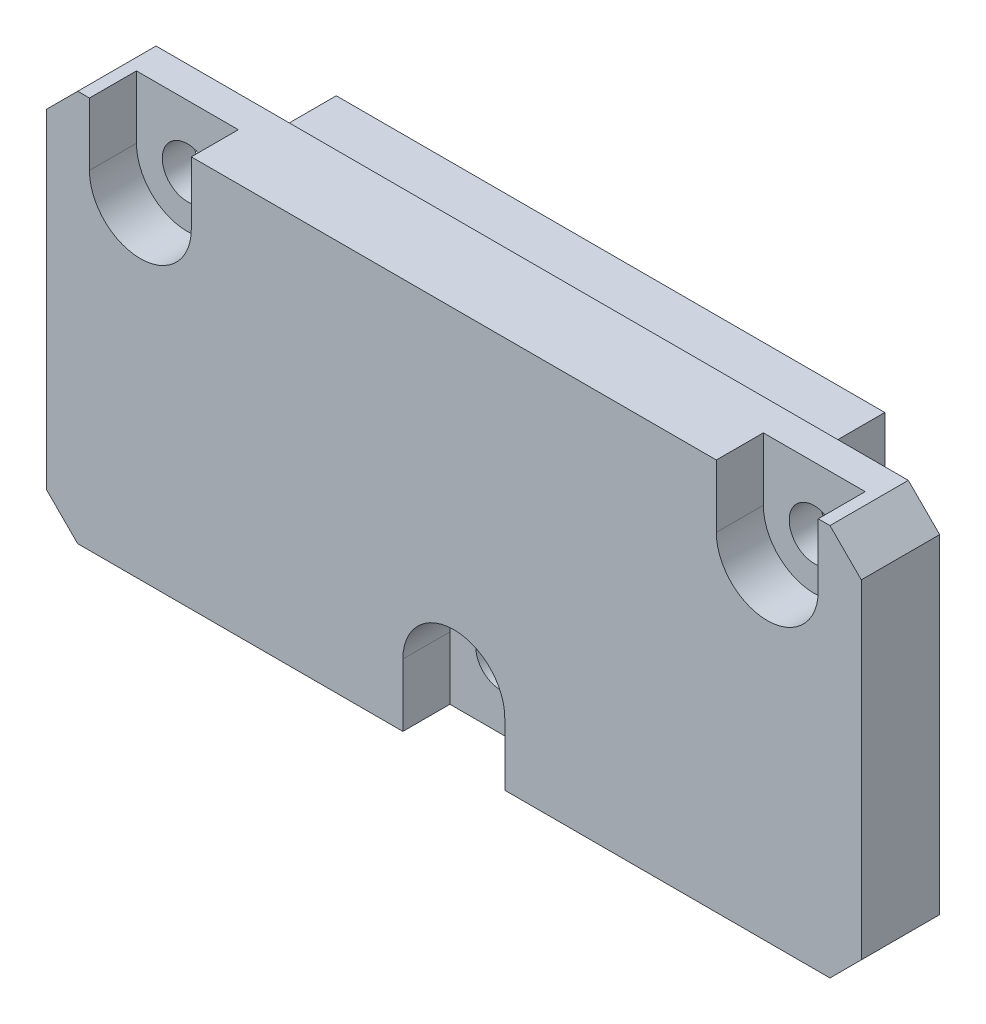
ISO-10303-21;
HEADER;
FILE_DESCRIPTION(('STEP AP214'),'2;1');
FILE_NAME('part.step','',(''),(''),'','','');
FILE_SCHEMA(('AUTOMOTIVE_DESIGN { 1 0 10303 214 1 1 1 1 }'));
ENDSEC;
DATA;
#1=APPLICATION_CONTEXT('core data for automotive mechanical design processes');
#2=APPLICATION_PROTOCOL_DEFINITION('international standard','automotive_design',2000,#1);
#3=PRODUCT_CONTEXT('',#1,'mechanical');
#4=PRODUCT('Part','Part','',(#3));
#5=PRODUCT_RELATED_PRODUCT_CATEGORY('part','',(#4));
#6=PRODUCT_DEFINITION_FORMATION('','',#4);
#7=PRODUCT_DEFINITION_CONTEXT('part definition',#1,'design');
#8=PRODUCT_DEFINITION('design','',#6,#7);
#9=PRODUCT_DEFINITION_SHAPE('','',#8);
#10=(LENGTH_UNIT() NAMED_UNIT(*) SI_UNIT(.MILLI.,.METRE.));
#11=(NAMED_UNIT(*) PLANE_ANGLE_UNIT() SI_UNIT($,.RADIAN.));
#12=(NAMED_UNIT(*) SI_UNIT($,.STERADIAN.) SOLID_ANGLE_UNIT());
#13=UNCERTAINTY_MEASURE_WITH_UNIT(LENGTH_MEASURE(1.E-05),#10,'distance_accuracy_value','');
#14=(GEOMETRIC_REPRESENTATION_CONTEXT(3) GLOBAL_UNCERTAINTY_ASSIGNED_CONTEXT((#13)) GLOBAL_UNIT_ASSIGNED_CONTEXT((#10,
#11,#12)) REPRESENTATION_CONTEXT('',''));
#15=CARTESIAN_POINT('',(0.,0.,0.));
#16=DIRECTION('',(0.,0.,1.));
#17=DIRECTION('',(1.,0.,0.));
#18=AXIS2_PLACEMENT_3D('',#15,#16,#17);
#19=CARTESIAN_POINT('',(-26.,12.5,5.));
#20=DIRECTION('',(0.,-1.,0.));
#21=DIRECTION('',(0.,0.,-1.));
#22=AXIS2_PLACEMENT_3D('',#19,#20,#21);
#23=PLANE('',#22);
#24=DIRECTION('',(0.,0.,1.));
#25=VECTOR('',#24,1.);
#26=CARTESIAN_POINT('',(16.75,12.5,2.));
#27=LINE('',#26,#25);
#28=CARTESIAN_POINT('',(16.75,12.5,2.));
#29=VERTEX_POINT('',#28);
#30=CARTESIAN_POINT('',(16.75,12.5,5.));
#31=VERTEX_POINT('',#30);
#32=EDGE_CURVE('E229',#29,#31,#27,.T.);
#33=ORIENTED_EDGE('',*,*,#32,.F.);
#34=DIRECTION('',(-1.,0.,0.));
#35=VECTOR('',#34,1.);
#36=CARTESIAN_POINT('',(0.,12.5,2.));
#37=LINE('',#36,#35);
#38=CARTESIAN_POINT('',(23.25,12.5,2.));
#39=VERTEX_POINT('',#38);
#40=EDGE_CURVE('E210',#39,#29,#37,.T.);
#41=ORIENTED_EDGE('',*,*,#40,.F.);
#42=DIRECTION('',(0.,0.,1.));
#43=VECTOR('',#42,1.);
#44=CARTESIAN_POINT('',(23.25,12.5,2.));
#45=LINE('',#44,#43);
#46=CARTESIAN_POINT('',(23.25,12.5,5.));
#47=VERTEX_POINT('',#46);
#48=EDGE_CURVE('E200',#39,#47,#45,.T.);
#49=ORIENTED_EDGE('',*,*,#48,.T.);
#50=DIRECTION('',(-1.,0.,0.));
#51=VECTOR('',#50,1.);
#52=CARTESIAN_POINT('',(-26.,12.5,5.));
#53=LINE('',#52,#51);
#54=CARTESIAN_POINT('',(24.,12.5,5.));
#55=VERTEX_POINT('',#54);
#56=EDGE_CURVE('E321',#55,#47,#53,.T.);
#57=ORIENTED_EDGE('',*,*,#56,.F.);
#58=DIRECTION('',(0.,0.,-1.));
#59=VECTOR('',#58,1.);
#60=CARTESIAN_POINT('',(24.,12.5,5.));
#61=LINE('',#60,#59);
#62=CARTESIAN_POINT('',(24.,12.5,0.));
#63=VERTEX_POINT('',#62);
#64=EDGE_CURVE('E42',#55,#63,#61,.T.);
#65=ORIENTED_EDGE('',*,*,#64,.T.);
#66=DIRECTION('',(-1.,0.,0.));
#67=VECTOR('',#66,1.);
#68=CARTESIAN_POINT('',(-26.,12.5,0.));
#69=LINE('',#68,#67);
#70=CARTESIAN_POINT('',(-24.,12.5,0.));
#71=VERTEX_POINT('',#70);
#72=EDGE_CURVE('E335',#63,#71,#69,.T.);
#73=ORIENTED_EDGE('',*,*,#72,.T.);
#74=DIRECTION('',(0.,0.,1.));
#75=VECTOR('',#74,1.);
#76=CARTESIAN_POINT('',(-24.,12.5,5.));
#77=LINE('',#76,#75);
#78=CARTESIAN_POINT('',(-24.,12.5,5.));
#79=VERTEX_POINT('',#78);
#80=EDGE_CURVE('E11',#71,#79,#77,.T.);
#81=ORIENTED_EDGE('',*,*,#80,.T.);
#82=CARTESIAN_POINT('',(-23.25,12.5,5.));
#83=VERTEX_POINT('',#82);
#84=EDGE_CURVE('E319',#83,#79,#53,.T.);
#85=ORIENTED_EDGE('',*,*,#84,.F.);
#86=DIRECTION('',(0.,0.,1.));
#87=VECTOR('',#86,1.);
#88=CARTESIAN_POINT('',(-23.25,12.5,2.));
#89=LINE('',#88,#87);
#90=CARTESIAN_POINT('',(-23.25,12.5,2.));
#91=VERTEX_POINT('',#90);
#92=EDGE_CURVE('E250',#91,#83,#89,.T.);
#93=ORIENTED_EDGE('',*,*,#92,.F.);
#94=DIRECTION('',(-1.,0.,0.));
#95=VECTOR('',#94,1.);
#96=CARTESIAN_POINT('',(0.,12.5,2.));
#97=LINE('',#96,#95);
#98=CARTESIAN_POINT('',(-16.75,12.5,2.));
#99=VERTEX_POINT('',#98);
#100=EDGE_CURVE('E240',#99,#91,#97,.T.);
#101=ORIENTED_EDGE('',*,*,#100,.F.);
#102=DIRECTION('',(0.,0.,1.));
#103=VECTOR('',#102,1.);
#104=CARTESIAN_POINT('',(-16.75,12.5,2.));
#105=LINE('',#104,#103);
#106=CARTESIAN_POINT('',(-16.75,12.5,5.));
#107=VERTEX_POINT('',#106);
#108=EDGE_CURVE('E253',#99,#107,#105,.T.);
#109=ORIENTED_EDGE('',*,*,#108,.T.);
#110=EDGE_CURVE('E325',#31,#107,#53,.T.);
#111=ORIENTED_EDGE('',*,*,#110,.F.);
#112=EDGE_LOOP('',(#33,#41,#49,#57,#65,#73,#81,#85,#93,#101,#109,#111));
#113=FACE_BOUND('',#112,.T.);
#114=ADVANCED_FACE('F34',(#113),#23,.F.);
#115=CARTESIAN_POINT('',(0.,0.,5.));
#116=DIRECTION('',(0.,0.,-1.));
#117=DIRECTION('',(-1.,0.,0.));
#118=AXIS2_PLACEMENT_3D('',#115,#116,#117);
#119=PLANE('',#118);
#120=DIRECTION('',(0.,1.,0.));
#121=VECTOR('',#120,1.);
#122=CARTESIAN_POINT('',(16.75,0.,5.));
#123=LINE('',#122,#121);
#124=CARTESIAN_POINT('',(16.75,8.5,5.));
#125=VERTEX_POINT('',#124);
#126=EDGE_CURVE('E214',#125,#31,#123,.T.);
#127=ORIENTED_EDGE('',*,*,#126,.T.);
#128=ORIENTED_EDGE('',*,*,#110,.T.);
#129=DIRECTION('',(0.,-1.,0.));
#130=VECTOR('',#129,1.);
#131=CARTESIAN_POINT('',(-16.75,0.,5.));
#132=LINE('',#131,#130);
#133=CARTESIAN_POINT('',(-16.75,8.5,5.));
#134=VERTEX_POINT('',#133);
#135=EDGE_CURVE('E235',#107,#134,#132,.T.);
#136=ORIENTED_EDGE('',*,*,#135,.T.);
#137=CARTESIAN_POINT('',(-20.,8.5,5.));
#138=DIRECTION('',(0.,0.,1.));
#139=DIRECTION('',(1.,0.,0.));
#140=AXIS2_PLACEMENT_3D('',#137,#138,#139);
#141=CIRCLE('',#140,3.25);
#142=CARTESIAN_POINT('',(-23.25,8.5,5.));
#143=VERTEX_POINT('',#142);
#144=EDGE_CURVE('E245',#143,#134,#141,.T.);
#145=ORIENTED_EDGE('',*,*,#144,.F.);
#146=DIRECTION('',(0.,1.,0.));
#147=VECTOR('',#146,1.);
#148=CARTESIAN_POINT('',(-23.25,0.,5.));
#149=LINE('',#148,#147);
#150=EDGE_CURVE('E57',#143,#83,#149,.T.);
#151=ORIENTED_EDGE('',*,*,#150,.T.);
#152=ORIENTED_EDGE('',*,*,#84,.T.);
#153=DIRECTION('',(0.707106781186549,0.707106781186546,0.));
#154=VECTOR('',#153,1.);
#155=CARTESIAN_POINT('',(-26.,10.5,5.));
#156=LINE('',#155,#154);
#157=CARTESIAN_POINT('',(-26.,10.5,5.));
#158=VERTEX_POINT('',#157);
#159=EDGE_CURVE('E363',#79,#158,#156,.F.);
#160=ORIENTED_EDGE('',*,*,#159,.T.);
#161=DIRECTION('',(0.,-1.,0.));
#162=VECTOR('',#161,1.);
#163=CARTESIAN_POINT('',(-26.0000000000001,-12.5,5.));
#164=LINE('',#163,#162);
#165=CARTESIAN_POINT('',(-26.0000000000001,-10.5,5.));
#166=VERTEX_POINT('',#165);
#167=EDGE_CURVE('E324',#158,#166,#164,.T.);
#168=ORIENTED_EDGE('',*,*,#167,.T.);
#169=DIRECTION('',(-0.707106781186545,0.70710678118655,0.));
#170=VECTOR('',#169,1.);
#171=CARTESIAN_POINT('',(-24.0000000000001,-12.5,5.));
#172=LINE('',#171,#170);
#173=CARTESIAN_POINT('',(-24.0000000000001,-12.5,5.));
#174=VERTEX_POINT('',#173);
#175=EDGE_CURVE('E365',#166,#174,#172,.F.);
#176=ORIENTED_EDGE('',*,*,#175,.T.);
#177=DIRECTION('',(1.,0.,0.));
#178=VECTOR('',#177,1.);
#179=CARTESIAN_POINT('',(-26.0000000000001,-12.5,5.));
#180=LINE('',#179,#178);
#181=CARTESIAN_POINT('',(-3.25000000000001,-12.5,5.));
#182=VERTEX_POINT('',#181);
#183=EDGE_CURVE('E329',#174,#182,#180,.T.);
#184=ORIENTED_EDGE('',*,*,#183,.T.);
#185=DIRECTION('',(0.,-1.,0.));
#186=VECTOR('',#185,1.);
#187=CARTESIAN_POINT('',(-3.25,0.,5.));
#188=LINE('',#187,#186);
#189=CARTESIAN_POINT('',(-3.25,-8.5,5.));
#190=VERTEX_POINT('',#189);
#191=EDGE_CURVE('E273',#190,#182,#188,.T.);
#192=ORIENTED_EDGE('',*,*,#191,.F.);
#193=CARTESIAN_POINT('',(0.,-8.5,5.));
#194=DIRECTION('',(0.,0.,1.));
#195=DIRECTION('',(1.,0.,0.));
#196=AXIS2_PLACEMENT_3D('',#193,#194,#195);
#197=CIRCLE('',#196,3.25);
#198=CARTESIAN_POINT('',(3.25,-8.5,5.));
#199=VERTEX_POINT('',#198);
#200=EDGE_CURVE('E252',#199,#190,#197,.T.);
#201=ORIENTED_EDGE('',*,*,#200,.F.);
#202=DIRECTION('',(0.,1.,0.));
#203=VECTOR('',#202,1.);
#204=CARTESIAN_POINT('',(3.25,0.,5.));
#205=LINE('',#204,#203);
#206=CARTESIAN_POINT('',(3.24999999999999,-12.5,5.));
#207=VERTEX_POINT('',#206);
#208=EDGE_CURVE('E263',#207,#199,#205,.T.);
#209=ORIENTED_EDGE('',*,*,#208,.F.);
#210=CARTESIAN_POINT('',(23.9999999999999,-12.5,5.));
#211=VERTEX_POINT('',#210);
#212=EDGE_CURVE('E328',#207,#211,#180,.T.);
#213=ORIENTED_EDGE('',*,*,#212,.T.);
#214=DIRECTION('',(-0.707106781186549,-0.707106781186546,0.));
#215=VECTOR('',#214,1.);
#216=CARTESIAN_POINT('',(25.9999999999999,-10.5,5.));
#217=LINE('',#216,#215);
#218=CARTESIAN_POINT('',(25.9999999999999,-10.5,5.));
#219=VERTEX_POINT('',#218);
#220=EDGE_CURVE('E367',#211,#219,#217,.F.);
#221=ORIENTED_EDGE('',*,*,#220,.T.);
#222=DIRECTION('',(0.,1.,0.));
#223=VECTOR('',#222,1.);
#224=CARTESIAN_POINT('',(25.9999999999999,-12.5,5.));
#225=LINE('',#224,#223);
#226=CARTESIAN_POINT('',(26.,10.5,5.));
#227=VERTEX_POINT('',#226);
#228=EDGE_CURVE('E316',#219,#227,#225,.T.);
#229=ORIENTED_EDGE('',*,*,#228,.T.);
#230=DIRECTION('',(0.707106781186545,-0.70710678118655,0.));
#231=VECTOR('',#230,1.);
#232=CARTESIAN_POINT('',(24.,12.5,5.));
#233=LINE('',#232,#231);
#234=EDGE_CURVE('E361',#227,#55,#233,.F.);
#235=ORIENTED_EDGE('',*,*,#234,.T.);
#236=ORIENTED_EDGE('',*,*,#56,.T.);
#237=DIRECTION('',(0.,1.,0.));
#238=VECTOR('',#237,1.);
#239=CARTESIAN_POINT('',(23.25,0.,5.));
#240=LINE('',#239,#238);
#241=CARTESIAN_POINT('',(23.25,8.5,5.));
#242=VERTEX_POINT('',#241);
#243=EDGE_CURVE('E217',#242,#47,#240,.T.);
#244=ORIENTED_EDGE('',*,*,#243,.F.);
#245=CARTESIAN_POINT('',(20.,8.5,5.));
#246=DIRECTION('',(0.,0.,1.));
#247=DIRECTION('',(1.,0.,0.));
#248=AXIS2_PLACEMENT_3D('',#245,#246,#247);
#249=CIRCLE('',#248,3.25);
#250=EDGE_CURVE('E49',#125,#242,#249,.T.);
#251=ORIENTED_EDGE('',*,*,#250,.F.);
#252=EDGE_LOOP('',(#127,#128,#136,#145,#151,#152,#160,#168,#176,#184,#192,#201,#209,#213,#221,
#229,#235,#236,#244,#251));
#253=FACE_BOUND('',#252,.T.);
#254=ADVANCED_FACE('F397',(#253),#119,.F.);
#255=CARTESIAN_POINT('',(0.,0.,0.));
#256=DIRECTION('',(0.,0.,-1.));
#257=DIRECTION('',(-1.,0.,0.));
#258=AXIS2_PLACEMENT_3D('',#255,#256,#257);
#259=PLANE('',#258);
#260=CARTESIAN_POINT('',(20.,8.5,0.));
#261=DIRECTION('',(0.,0.,-1.));
#262=DIRECTION('',(-1.,0.,0.));
#263=AXIS2_PLACEMENT_3D('',#260,#261,#262);
#264=CIRCLE('',#263,1.6);
#265=CARTESIAN_POINT('',(18.4,8.5,0.));
#266=VERTEX_POINT('',#265);
#267=EDGE_CURVE('E695',#266,#266,#264,.T.);
#268=ORIENTED_EDGE('',*,*,#267,.F.);
#269=EDGE_LOOP('',(#268));
#270=FACE_BOUND('',#269,.T.);
#271=CARTESIAN_POINT('',(-20.,8.5,0.));
#272=DIRECTION('',(0.,0.,-1.));
#273=DIRECTION('',(-1.,0.,0.));
#274=AXIS2_PLACEMENT_3D('',#271,#272,#273);
#275=CIRCLE('',#274,1.6);
#276=CARTESIAN_POINT('',(-21.6,8.5,0.));
#277=VERTEX_POINT('',#276);
#278=EDGE_CURVE('E699',#277,#277,#275,.T.);
#279=ORIENTED_EDGE('',*,*,#278,.F.);
#280=EDGE_LOOP('',(#279));
#281=FACE_BOUND('',#280,.T.);
#282=CARTESIAN_POINT('',(0.,-8.5,0.));
#283=DIRECTION('',(0.,0.,-1.));
#284=DIRECTION('',(-1.,0.,0.));
#285=AXIS2_PLACEMENT_3D('',#282,#283,#284);
#286=CIRCLE('',#285,1.6);
#287=CARTESIAN_POINT('',(-1.6,-8.5,0.));
#288=VERTEX_POINT('',#287);
#289=EDGE_CURVE('E220',#288,#288,#286,.T.);
#290=ORIENTED_EDGE('',*,*,#289,.F.);
#291=EDGE_LOOP('',(#290));
#292=FACE_BOUND('',#291,.T.);
#293=DIRECTION('',(0.,1.,0.));
#294=VECTOR('',#293,1.);
#295=CARTESIAN_POINT('',(25.9999999999999,-12.5,0.));
#296=LINE('',#295,#294);
#297=CARTESIAN_POINT('',(25.9999999999999,-10.5,0.));
#298=VERTEX_POINT('',#297);
#299=CARTESIAN_POINT('',(26.,10.5,0.));
#300=VERTEX_POINT('',#299);
#301=EDGE_CURVE('E315',#298,#300,#296,.T.);
#302=ORIENTED_EDGE('',*,*,#301,.F.);
#303=DIRECTION('',(0.707106781186549,0.707106781186546,0.));
#304=VECTOR('',#303,1.);
#305=CARTESIAN_POINT('',(18.25,-18.25,0.));
#306=LINE('',#305,#304);
#307=CARTESIAN_POINT('',(23.9999999999999,-12.5,0.));
#308=VERTEX_POINT('',#307);
#309=EDGE_CURVE('E353',#298,#308,#306,.F.);
#310=ORIENTED_EDGE('',*,*,#309,.T.);
#311=DIRECTION('',(1.,0.,0.));
#312=VECTOR('',#311,1.);
#313=CARTESIAN_POINT('',(-26.0000000000001,-12.5,0.));
#314=LINE('',#313,#312);
#315=CARTESIAN_POINT('',(-24.0000000000001,-12.5,0.));
#316=VERTEX_POINT('',#315);
#317=EDGE_CURVE('E320',#316,#308,#314,.T.);
#318=ORIENTED_EDGE('',*,*,#317,.F.);
#319=DIRECTION('',(0.707106781186545,-0.70710678118655,0.));
#320=VECTOR('',#319,1.);
#321=CARTESIAN_POINT('',(-18.2500000000001,-18.25,0.));
#322=LINE('',#321,#320);
#323=CARTESIAN_POINT('',(-26.0000000000001,-10.5,0.));
#324=VERTEX_POINT('',#323);
#325=EDGE_CURVE('E351',#316,#324,#322,.F.);
#326=ORIENTED_EDGE('',*,*,#325,.T.);
#327=DIRECTION('',(0.,-1.,0.));
#328=VECTOR('',#327,1.);
#329=CARTESIAN_POINT('',(-26.0000000000001,-12.5,0.));
#330=LINE('',#329,#328);
#331=CARTESIAN_POINT('',(-26.,10.5,0.));
#332=VERTEX_POINT('',#331);
#333=EDGE_CURVE('E338',#332,#324,#330,.T.);
#334=ORIENTED_EDGE('',*,*,#333,.F.);
#335=DIRECTION('',(-0.707106781186549,-0.707106781186546,0.));
#336=VECTOR('',#335,1.);
#337=CARTESIAN_POINT('',(-18.25,18.25,0.));
#338=LINE('',#337,#336);
#339=EDGE_CURVE('E349',#332,#71,#338,.F.);
#340=ORIENTED_EDGE('',*,*,#339,.T.);
#341=ORIENTED_EDGE('',*,*,#72,.F.);
#342=DIRECTION('',(-0.707106781186545,0.70710678118655,0.));
#343=VECTOR('',#342,1.);
#344=CARTESIAN_POINT('',(18.25,18.25,0.));
#345=LINE('',#344,#343);
#346=EDGE_CURVE('E347',#63,#300,#345,.F.);
#347=ORIENTED_EDGE('',*,*,#346,.T.);
#348=EDGE_LOOP('',(#302,#310,#318,#326,#334,#340,#341,#347));
#349=FACE_BOUND('',#348,.T.);
#350=DIRECTION('',(-1.,0.,0.));
#351=VECTOR('',#350,1.);
#352=CARTESIAN_POINT('',(-17.5,-4.5,0.));
#353=LINE('',#352,#351);
#354=CARTESIAN_POINT('',(17.5,-4.5,0.));
#355=VERTEX_POINT('',#354);
#356=CARTESIAN_POINT('',(-17.5,-4.5,0.));
#357=VERTEX_POINT('',#356);
#358=EDGE_CURVE('E300',#355,#357,#353,.T.);
#359=ORIENTED_EDGE('',*,*,#358,.F.);
#360=DIRECTION('',(0.,-1.,0.));
#361=VECTOR('',#360,1.);
#362=CARTESIAN_POINT('',(17.5,-4.5,0.));
#363=LINE('',#362,#361);
#364=CARTESIAN_POINT('',(17.5,10.5,0.));
#365=VERTEX_POINT('',#364);
#366=EDGE_CURVE('E279',#365,#355,#363,.T.);
#367=ORIENTED_EDGE('',*,*,#366,.F.);
#368=DIRECTION('',(1.,0.,0.));
#369=VECTOR('',#368,1.);
#370=CARTESIAN_POINT('',(-17.5,10.5,0.));
#371=LINE('',#370,#369);
#372=CARTESIAN_POINT('',(-17.5,10.5,0.));
#373=VERTEX_POINT('',#372);
#374=EDGE_CURVE('E291',#373,#365,#371,.T.);
#375=ORIENTED_EDGE('',*,*,#374,.F.);
#376=DIRECTION('',(0.,1.,0.));
#377=VECTOR('',#376,1.);
#378=CARTESIAN_POINT('',(-17.5,-4.5,0.));
#379=LINE('',#378,#377);
#380=EDGE_CURVE('E302',#357,#373,#379,.T.);
#381=ORIENTED_EDGE('',*,*,#380,.F.);
#382=EDGE_LOOP('',(#359,#367,#375,#381));
#383=FACE_BOUND('',#382,.T.);
#384=ADVANCED_FACE('F384',(#270,#281,#292,#349,#383),#259,.T.);
#385=CARTESIAN_POINT('',(25.9999999999999,-12.5,5.));
#386=DIRECTION('',(-1.,0.,0.));
#387=DIRECTION('',(0.,0.,1.));
#388=AXIS2_PLACEMENT_3D('',#385,#386,#387);
#389=PLANE('',#388);
#390=ORIENTED_EDGE('',*,*,#228,.F.);
#391=DIRECTION('',(0.,0.,-1.));
#392=VECTOR('',#391,1.);
#393=CARTESIAN_POINT('',(25.9999999999999,-10.5,5.));
#394=LINE('',#393,#392);
#395=EDGE_CURVE('E344',#219,#298,#394,.T.);
#396=ORIENTED_EDGE('',*,*,#395,.T.);
#397=ORIENTED_EDGE('',*,*,#301,.T.);
#398=DIRECTION('',(0.,0.,1.));
#399=VECTOR('',#398,1.);
#400=CARTESIAN_POINT('',(26.,10.5,5.));
#401=LINE('',#400,#399);
#402=EDGE_CURVE('E332',#300,#227,#401,.T.);
#403=ORIENTED_EDGE('',*,*,#402,.T.);
#404=EDGE_LOOP('',(#390,#396,#397,#403));
#405=FACE_BOUND('',#404,.T.);
#406=ADVANCED_FACE('F413',(#405),#389,.F.);
#407=CARTESIAN_POINT('',(-26.0000000000001,-12.5,5.));
#408=DIRECTION('',(1.,0.,0.));
#409=DIRECTION('',(0.,0.,-1.));
#410=AXIS2_PLACEMENT_3D('',#407,#408,#409);
#411=PLANE('',#410);
#412=ORIENTED_EDGE('',*,*,#333,.T.);
#413=DIRECTION('',(0.,0.,1.));
#414=VECTOR('',#413,1.);
#415=CARTESIAN_POINT('',(-26.0000000000001,-10.5,5.));
#416=LINE('',#415,#414);
#417=EDGE_CURVE('E372',#324,#166,#416,.T.);
#418=ORIENTED_EDGE('',*,*,#417,.T.);
#419=ORIENTED_EDGE('',*,*,#167,.F.);
#420=DIRECTION('',(0.,0.,-1.));
#421=VECTOR('',#420,1.);
#422=CARTESIAN_POINT('',(-26.,10.5,5.));
#423=LINE('',#422,#421);
#424=EDGE_CURVE('E369',#158,#332,#423,.T.);
#425=ORIENTED_EDGE('',*,*,#424,.T.);
#426=EDGE_LOOP('',(#412,#418,#419,#425));
#427=FACE_BOUND('',#426,.T.);
#428=ADVANCED_FACE('F393',(#427),#411,.F.);
#429=CARTESIAN_POINT('',(-26.0000000000001,-12.5,5.));
#430=DIRECTION('',(0.,1.,0.));
#431=DIRECTION('',(0.,0.,1.));
#432=AXIS2_PLACEMENT_3D('',#429,#430,#431);
#433=PLANE('',#432);
#434=ORIENTED_EDGE('',*,*,#212,.F.);
#435=DIRECTION('',(0.,0.,1.));
#436=VECTOR('',#435,1.);
#437=CARTESIAN_POINT('',(3.24999999999999,-12.5,2.));
#438=LINE('',#437,#436);
#439=CARTESIAN_POINT('',(3.24999999999999,-12.5,2.));
#440=VERTEX_POINT('',#439);
#441=EDGE_CURVE('E280',#440,#207,#438,.T.);
#442=ORIENTED_EDGE('',*,*,#441,.F.);
#443=DIRECTION('',(1.,0.,0.));
#444=VECTOR('',#443,1.);
#445=CARTESIAN_POINT('',(0.,-12.5,2.));
#446=LINE('',#445,#444);
#447=CARTESIAN_POINT('',(-3.25000000000001,-12.5,2.));
#448=VERTEX_POINT('',#447);
#449=EDGE_CURVE('E266',#448,#440,#446,.T.);
#450=ORIENTED_EDGE('',*,*,#449,.F.);
#451=DIRECTION('',(0.,0.,1.));
#452=VECTOR('',#451,1.);
#453=CARTESIAN_POINT('',(-3.25000000000001,-12.5,2.));
#454=LINE('',#453,#452);
#455=EDGE_CURVE('E282',#448,#182,#454,.T.);
#456=ORIENTED_EDGE('',*,*,#455,.T.);
#457=ORIENTED_EDGE('',*,*,#183,.F.);
#458=DIRECTION('',(0.,0.,-1.));
#459=VECTOR('',#458,1.);
#460=CARTESIAN_POINT('',(-24.0000000000001,-12.5,5.));
#461=LINE('',#460,#459);
#462=EDGE_CURVE('E355',#174,#316,#461,.T.);
#463=ORIENTED_EDGE('',*,*,#462,.T.);
#464=ORIENTED_EDGE('',*,*,#317,.T.);
#465=DIRECTION('',(0.,0.,1.));
#466=VECTOR('',#465,1.);
#467=CARTESIAN_POINT('',(23.9999999999999,-12.5,5.));
#468=LINE('',#467,#466);
#469=EDGE_CURVE('E358',#308,#211,#468,.T.);
#470=ORIENTED_EDGE('',*,*,#469,.T.);
#471=EDGE_LOOP('',(#434,#442,#450,#456,#457,#463,#464,#470));
#472=FACE_BOUND('',#471,.T.);
#473=ADVANCED_FACE('F405',(#472),#433,.F.);
#474=CARTESIAN_POINT('',(25.9999999999999,-10.5,5.));
#475=DIRECTION('',(-0.707106781186546,0.707106781186549,0.));
#476=DIRECTION('',(0.,0.,-1.));
#477=AXIS2_PLACEMENT_3D('',#474,#475,#476);
#478=PLANE('',#477);
#479=ORIENTED_EDGE('',*,*,#220,.F.);
#480=ORIENTED_EDGE('',*,*,#469,.F.);
#481=ORIENTED_EDGE('',*,*,#309,.F.);
#482=ORIENTED_EDGE('',*,*,#395,.F.);
#483=EDGE_LOOP('',(#479,#480,#481,#482));
#484=FACE_BOUND('',#483,.T.);
#485=ADVANCED_FACE('F410',(#484),#478,.F.);
#486=CARTESIAN_POINT('',(-24.0000000000001,-12.5,5.));
#487=DIRECTION('',(0.70710678118655,0.707106781186545,0.));
#488=DIRECTION('',(0.,0.,-1.));
#489=AXIS2_PLACEMENT_3D('',#486,#487,#488);
#490=PLANE('',#489);
#491=ORIENTED_EDGE('',*,*,#175,.F.);
#492=ORIENTED_EDGE('',*,*,#417,.F.);
#493=ORIENTED_EDGE('',*,*,#325,.F.);
#494=ORIENTED_EDGE('',*,*,#462,.F.);
#495=EDGE_LOOP('',(#491,#492,#493,#494));
#496=FACE_BOUND('',#495,.T.);
#497=ADVANCED_FACE('F401',(#496),#490,.F.);
#498=CARTESIAN_POINT('',(-26.,10.5,5.));
#499=DIRECTION('',(0.707106781186546,-0.707106781186549,0.));
#500=DIRECTION('',(0.,0.,-1.));
#501=AXIS2_PLACEMENT_3D('',#498,#499,#500);
#502=PLANE('',#501);
#503=ORIENTED_EDGE('',*,*,#159,.F.);
#504=ORIENTED_EDGE('',*,*,#80,.F.);
#505=ORIENTED_EDGE('',*,*,#339,.F.);
#506=ORIENTED_EDGE('',*,*,#424,.F.);
#507=EDGE_LOOP('',(#503,#504,#505,#506));
#508=FACE_BOUND('',#507,.T.);
#509=ADVANCED_FACE('F390',(#508),#502,.F.);
#510=CARTESIAN_POINT('',(24.,12.5,5.));
#511=DIRECTION('',(-0.70710678118655,-0.707106781186545,0.));
#512=DIRECTION('',(0.,0.,-1.));
#513=AXIS2_PLACEMENT_3D('',#510,#511,#512);
#514=PLANE('',#513);
#515=ORIENTED_EDGE('',*,*,#234,.F.);
#516=ORIENTED_EDGE('',*,*,#402,.F.);
#517=ORIENTED_EDGE('',*,*,#346,.F.);
#518=ORIENTED_EDGE('',*,*,#64,.F.);
#519=EDGE_LOOP('',(#515,#516,#517,#518));
#520=FACE_BOUND('',#519,.T.);
#521=ADVANCED_FACE('F36',(#520),#514,.F.);
#522=CARTESIAN_POINT('',(17.5,-4.5,-5.));
#523=DIRECTION('',(-1.,0.,0.));
#524=DIRECTION('',(0.,0.,1.));
#525=AXIS2_PLACEMENT_3D('',#522,#523,#524);
#526=PLANE('',#525);
#527=ORIENTED_EDGE('',*,*,#366,.T.);
#528=DIRECTION('',(0.,0.,1.));
#529=VECTOR('',#528,1.);
#530=CARTESIAN_POINT('',(17.5,-4.5,-5.));
#531=LINE('',#530,#529);
#532=CARTESIAN_POINT('',(17.5,-4.5,-5.));
#533=VERTEX_POINT('',#532);
#534=EDGE_CURVE('E313',#533,#355,#531,.T.);
#535=ORIENTED_EDGE('',*,*,#534,.F.);
#536=DIRECTION('',(0.,-1.,0.));
#537=VECTOR('',#536,1.);
#538=CARTESIAN_POINT('',(17.5,-4.5,-5.));
#539=LINE('',#538,#537);
#540=CARTESIAN_POINT('',(17.5,10.5,-5.));
#541=VERTEX_POINT('',#540);
#542=EDGE_CURVE('E287',#541,#533,#539,.T.);
#543=ORIENTED_EDGE('',*,*,#542,.F.);
#544=DIRECTION('',(0.,0.,1.));
#545=VECTOR('',#544,1.);
#546=CARTESIAN_POINT('',(17.5,10.5,-5.));
#547=LINE('',#546,#545);
#548=EDGE_CURVE('E297',#541,#365,#547,.T.);
#549=ORIENTED_EDGE('',*,*,#548,.T.);
#550=EDGE_LOOP('',(#527,#535,#543,#549));
#551=FACE_BOUND('',#550,.T.);
#552=ADVANCED_FACE('F416',(#551),#526,.F.);
#553=CARTESIAN_POINT('',(-17.5,-4.5,-5.));
#554=DIRECTION('',(0.,1.,0.));
#555=DIRECTION('',(0.,0.,1.));
#556=AXIS2_PLACEMENT_3D('',#553,#554,#555);
#557=PLANE('',#556);
#558=ORIENTED_EDGE('',*,*,#358,.T.);
#559=DIRECTION('',(0.,0.,1.));
#560=VECTOR('',#559,1.);
#561=CARTESIAN_POINT('',(-17.5,-4.5,-5.));
#562=LINE('',#561,#560);
#563=CARTESIAN_POINT('',(-17.5,-4.5,-5.));
#564=VERTEX_POINT('',#563);
#565=EDGE_CURVE('E310',#564,#357,#562,.T.);
#566=ORIENTED_EDGE('',*,*,#565,.F.);
#567=DIRECTION('',(-1.,0.,0.));
#568=VECTOR('',#567,1.);
#569=CARTESIAN_POINT('',(-17.5,-4.5,-5.));
#570=LINE('',#569,#568);
#571=EDGE_CURVE('E290',#533,#564,#570,.T.);
#572=ORIENTED_EDGE('',*,*,#571,.F.);
#573=ORIENTED_EDGE('',*,*,#534,.T.);
#574=EDGE_LOOP('',(#558,#566,#572,#573));
#575=FACE_BOUND('',#574,.T.);
#576=ADVANCED_FACE('F421',(#575),#557,.F.);
#577=CARTESIAN_POINT('',(-17.5,-4.5,-5.));
#578=DIRECTION('',(1.,0.,0.));
#579=DIRECTION('',(0.,0.,-1.));
#580=AXIS2_PLACEMENT_3D('',#577,#578,#579);
#581=PLANE('',#580);
#582=ORIENTED_EDGE('',*,*,#380,.T.);
#583=DIRECTION('',(0.,0.,1.));
#584=VECTOR('',#583,1.);
#585=CARTESIAN_POINT('',(-17.5,10.5,-5.));
#586=LINE('',#585,#584);
#587=CARTESIAN_POINT('',(-17.5,10.5,-5.));
#588=VERTEX_POINT('',#587);
#589=EDGE_CURVE('E308',#588,#373,#586,.T.);
#590=ORIENTED_EDGE('',*,*,#589,.F.);
#591=DIRECTION('',(0.,1.,0.));
#592=VECTOR('',#591,1.);
#593=CARTESIAN_POINT('',(-17.5,-4.5,-5.));
#594=LINE('',#593,#592);
#595=EDGE_CURVE('E293',#564,#588,#594,.T.);
#596=ORIENTED_EDGE('',*,*,#595,.F.);
#597=ORIENTED_EDGE('',*,*,#565,.T.);
#598=EDGE_LOOP('',(#582,#590,#596,#597));
#599=FACE_BOUND('',#598,.T.);
#600=ADVANCED_FACE('F467',(#599),#581,.F.);
#601=CARTESIAN_POINT('',(-17.5,10.5,-5.));
#602=DIRECTION('',(0.,-1.,0.));
#603=DIRECTION('',(0.,0.,-1.));
#604=AXIS2_PLACEMENT_3D('',#601,#602,#603);
#605=PLANE('',#604);
#606=ORIENTED_EDGE('',*,*,#374,.T.);
#607=ORIENTED_EDGE('',*,*,#548,.F.);
#608=DIRECTION('',(1.,0.,0.));
#609=VECTOR('',#608,1.);
#610=CARTESIAN_POINT('',(-17.5,10.5,-5.));
#611=LINE('',#610,#609);
#612=EDGE_CURVE('E295',#588,#541,#611,.T.);
#613=ORIENTED_EDGE('',*,*,#612,.F.);
#614=ORIENTED_EDGE('',*,*,#589,.T.);
#615=EDGE_LOOP('',(#606,#607,#613,#614));
#616=FACE_BOUND('',#615,.T.);
#617=ADVANCED_FACE('F477',(#616),#605,.F.);
#618=CARTESIAN_POINT('',(0.,0.,-5.));
#619=DIRECTION('',(0.,0.,-1.));
#620=DIRECTION('',(-1.,0.,0.));
#621=AXIS2_PLACEMENT_3D('',#618,#619,#620);
#622=PLANE('',#621);
#623=ORIENTED_EDGE('',*,*,#542,.T.);
#624=ORIENTED_EDGE('',*,*,#571,.T.);
#625=ORIENTED_EDGE('',*,*,#595,.T.);
#626=ORIENTED_EDGE('',*,*,#612,.T.);
#627=EDGE_LOOP('',(#623,#624,#625,#626));
#628=FACE_BOUND('',#627,.T.);
#629=ADVANCED_FACE('F487',(#628),#622,.T.);
#630=CARTESIAN_POINT('',(0.,-8.5,2.));
#631=DIRECTION('',(0.,0.,1.));
#632=DIRECTION('',(1.,0.,0.));
#633=AXIS2_PLACEMENT_3D('',#630,#631,#632);
#634=CYLINDRICAL_SURFACE('',#633,3.25);
#635=ORIENTED_EDGE('',*,*,#200,.T.);
#636=DIRECTION('',(0.,0.,1.));
#637=VECTOR('',#636,1.);
#638=CARTESIAN_POINT('',(-3.25,-8.5,2.));
#639=LINE('',#638,#637);
#640=CARTESIAN_POINT('',(-3.25,-8.5,2.));
#641=VERTEX_POINT('',#640);
#642=EDGE_CURVE('E271',#641,#190,#639,.T.);
#643=ORIENTED_EDGE('',*,*,#642,.F.);
#644=CARTESIAN_POINT('',(0.,-8.5,2.));
#645=DIRECTION('',(0.,0.,1.));
#646=DIRECTION('',(1.,0.,0.));
#647=AXIS2_PLACEMENT_3D('',#644,#645,#646);
#648=CIRCLE('',#647,3.25);
#649=CARTESIAN_POINT('',(3.25,-8.5,2.));
#650=VERTEX_POINT('',#649);
#651=EDGE_CURVE('E259',#650,#641,#648,.T.);
#652=ORIENTED_EDGE('',*,*,#651,.F.);
#653=DIRECTION('',(0.,0.,1.));
#654=VECTOR('',#653,1.);
#655=CARTESIAN_POINT('',(3.25,-8.5,2.));
#656=LINE('',#655,#654);
#657=EDGE_CURVE('E277',#650,#199,#656,.T.);
#658=ORIENTED_EDGE('',*,*,#657,.T.);
#659=EDGE_LOOP('',(#635,#643,#652,#658));
#660=FACE_BOUND('',#659,.T.);
#661=ADVANCED_FACE('F497',(#660),#634,.F.);
#662=CARTESIAN_POINT('',(3.25,0.,2.));
#663=DIRECTION('',(1.,0.,0.));
#664=DIRECTION('',(0.,1.,0.));
#665=AXIS2_PLACEMENT_3D('',#662,#663,#664);
#666=PLANE('',#665);
#667=ORIENTED_EDGE('',*,*,#208,.T.);
#668=ORIENTED_EDGE('',*,*,#657,.F.);
#669=DIRECTION('',(0.,1.,0.));
#670=VECTOR('',#669,1.);
#671=CARTESIAN_POINT('',(3.25,0.,2.));
#672=LINE('',#671,#670);
#673=EDGE_CURVE('E268',#440,#650,#672,.T.);
#674=ORIENTED_EDGE('',*,*,#673,.F.);
#675=ORIENTED_EDGE('',*,*,#441,.T.);
#676=EDGE_LOOP('',(#667,#668,#674,#675));
#677=FACE_BOUND('',#676,.T.);
#678=ADVANCED_FACE('F508',(#677),#666,.F.);
#679=CARTESIAN_POINT('',(-3.25,0.,2.));
#680=DIRECTION('',(-1.,0.,0.));
#681=DIRECTION('',(0.,-1.,0.));
#682=AXIS2_PLACEMENT_3D('',#679,#680,#681);
#683=PLANE('',#682);
#684=ORIENTED_EDGE('',*,*,#191,.T.);
#685=ORIENTED_EDGE('',*,*,#455,.F.);
#686=DIRECTION('',(0.,-1.,0.));
#687=VECTOR('',#686,1.);
#688=CARTESIAN_POINT('',(-3.25,0.,2.));
#689=LINE('',#688,#687);
#690=EDGE_CURVE('E262',#641,#448,#689,.T.);
#691=ORIENTED_EDGE('',*,*,#690,.F.);
#692=ORIENTED_EDGE('',*,*,#642,.T.);
#693=EDGE_LOOP('',(#684,#685,#691,#692));
#694=FACE_BOUND('',#693,.T.);
#695=ADVANCED_FACE('F519',(#694),#683,.F.);
#696=CARTESIAN_POINT('',(0.,0.,2.));
#697=DIRECTION('',(0.,0.,1.));
#698=DIRECTION('',(1.,0.,0.));
#699=AXIS2_PLACEMENT_3D('',#696,#697,#698);
#700=PLANE('',#699);
#701=CARTESIAN_POINT('',(0.,-8.5,2.));
#702=DIRECTION('',(0.,0.,1.));
#703=DIRECTION('',(1.,0.,0.));
#704=AXIS2_PLACEMENT_3D('',#701,#702,#703);
#705=CIRCLE('',#704,1.6);
#706=CARTESIAN_POINT('',(1.6,-8.5,2.));
#707=VERTEX_POINT('',#706);
#708=EDGE_CURVE('E702',#707,#707,#705,.T.);
#709=ORIENTED_EDGE('',*,*,#708,.F.);
#710=EDGE_LOOP('',(#709));
#711=FACE_BOUND('',#710,.T.);
#712=ORIENTED_EDGE('',*,*,#651,.T.);
#713=ORIENTED_EDGE('',*,*,#690,.T.);
#714=ORIENTED_EDGE('',*,*,#449,.T.);
#715=ORIENTED_EDGE('',*,*,#673,.T.);
#716=EDGE_LOOP('',(#712,#713,#714,#715));
#717=FACE_BOUND('',#716,.T.);
#718=ADVANCED_FACE('F529',(#711,#717),#700,.T.);
#719=CARTESIAN_POINT('',(-23.25,0.,2.));
#720=DIRECTION('',(1.,0.,0.));
#721=DIRECTION('',(0.,1.,0.));
#722=AXIS2_PLACEMENT_3D('',#719,#720,#721);
#723=PLANE('',#722);
#724=ORIENTED_EDGE('',*,*,#150,.F.);
#725=DIRECTION('',(0.,0.,1.));
#726=VECTOR('',#725,1.);
#727=CARTESIAN_POINT('',(-23.25,8.5,2.));
#728=LINE('',#727,#726);
#729=CARTESIAN_POINT('',(-23.25,8.5,2.));
#730=VERTEX_POINT('',#729);
#731=EDGE_CURVE('E243',#730,#143,#728,.T.);
#732=ORIENTED_EDGE('',*,*,#731,.F.);
#733=DIRECTION('',(0.,1.,0.));
#734=VECTOR('',#733,1.);
#735=CARTESIAN_POINT('',(-23.25,0.,2.));
#736=LINE('',#735,#734);
#737=EDGE_CURVE('E232',#730,#91,#736,.T.);
#738=ORIENTED_EDGE('',*,*,#737,.T.);
#739=ORIENTED_EDGE('',*,*,#92,.T.);
#740=EDGE_LOOP('',(#724,#732,#738,#739));
#741=FACE_BOUND('',#740,.T.);
#742=ADVANCED_FACE('F540',(#741),#723,.T.);
#743=CARTESIAN_POINT('',(-16.75,0.,2.));
#744=DIRECTION('',(-1.,0.,0.));
#745=DIRECTION('',(0.,-1.,0.));
#746=AXIS2_PLACEMENT_3D('',#743,#744,#745);
#747=PLANE('',#746);
#748=ORIENTED_EDGE('',*,*,#135,.F.);
#749=ORIENTED_EDGE('',*,*,#108,.F.);
#750=DIRECTION('',(0.,-1.,0.));
#751=VECTOR('',#750,1.);
#752=CARTESIAN_POINT('',(-16.75,0.,2.));
#753=LINE('',#752,#751);
#754=CARTESIAN_POINT('',(-16.75,8.5,2.));
#755=VERTEX_POINT('',#754);
#756=EDGE_CURVE('E238',#99,#755,#753,.T.);
#757=ORIENTED_EDGE('',*,*,#756,.T.);
#758=DIRECTION('',(0.,0.,1.));
#759=VECTOR('',#758,1.);
#760=CARTESIAN_POINT('',(-16.75,8.5,2.));
#761=LINE('',#760,#759);
#762=EDGE_CURVE('E256',#755,#134,#761,.T.);
#763=ORIENTED_EDGE('',*,*,#762,.T.);
#764=EDGE_LOOP('',(#748,#749,#757,#763));
#765=FACE_BOUND('',#764,.T.);
#766=ADVANCED_FACE('F550',(#765),#747,.T.);
#767=CARTESIAN_POINT('',(-20.,8.5,2.));
#768=DIRECTION('',(0.,0.,1.));
#769=DIRECTION('',(1.,0.,0.));
#770=AXIS2_PLACEMENT_3D('',#767,#768,#769);
#771=CYLINDRICAL_SURFACE('',#770,3.25);
#772=ORIENTED_EDGE('',*,*,#144,.T.);
#773=ORIENTED_EDGE('',*,*,#762,.F.);
#774=CARTESIAN_POINT('',(-20.,8.5,2.));
#775=DIRECTION('',(0.,0.,1.));
#776=DIRECTION('',(1.,0.,0.));
#777=AXIS2_PLACEMENT_3D('',#774,#775,#776);
#778=CIRCLE('',#777,3.25);
#779=EDGE_CURVE('E234',#730,#755,#778,.T.);
#780=ORIENTED_EDGE('',*,*,#779,.F.);
#781=ORIENTED_EDGE('',*,*,#731,.T.);
#782=EDGE_LOOP('',(#772,#773,#780,#781));
#783=FACE_BOUND('',#782,.T.);
#784=ADVANCED_FACE('F559',(#783),#771,.F.);
#785=CARTESIAN_POINT('',(0.,0.,2.));
#786=DIRECTION('',(0.,0.,1.));
#787=DIRECTION('',(1.,0.,0.));
#788=AXIS2_PLACEMENT_3D('',#785,#786,#787);
#789=PLANE('',#788);
#790=CARTESIAN_POINT('',(-20.,8.5,2.));
#791=DIRECTION('',(0.,0.,1.));
#792=DIRECTION('',(1.,0.,0.));
#793=AXIS2_PLACEMENT_3D('',#790,#791,#792);
#794=CIRCLE('',#793,1.6);
#795=CARTESIAN_POINT('',(-18.4,8.5,2.));
#796=VERTEX_POINT('',#795);
#797=EDGE_CURVE('E706',#796,#796,#794,.T.);
#798=ORIENTED_EDGE('',*,*,#797,.F.);
#799=EDGE_LOOP('',(#798));
#800=FACE_BOUND('',#799,.T.);
#801=ORIENTED_EDGE('',*,*,#737,.F.);
#802=ORIENTED_EDGE('',*,*,#779,.T.);
#803=ORIENTED_EDGE('',*,*,#756,.F.);
#804=ORIENTED_EDGE('',*,*,#100,.T.);
#805=EDGE_LOOP('',(#801,#802,#803,#804));
#806=FACE_BOUND('',#805,.T.);
#807=ADVANCED_FACE('F569',(#800,#806),#789,.T.);
#808=CARTESIAN_POINT('',(20.,8.5,2.));
#809=DIRECTION('',(0.,0.,1.));
#810=DIRECTION('',(1.,0.,0.));
#811=AXIS2_PLACEMENT_3D('',#808,#809,#810);
#812=CYLINDRICAL_SURFACE('',#811,3.25);
#813=ORIENTED_EDGE('',*,*,#250,.T.);
#814=DIRECTION('',(0.,0.,1.));
#815=VECTOR('',#814,1.);
#816=CARTESIAN_POINT('',(23.25,8.5,2.));
#817=LINE('',#816,#815);
#818=CARTESIAN_POINT('',(23.25,8.5,2.));
#819=VERTEX_POINT('',#818);
#820=EDGE_CURVE('E193',#819,#242,#817,.T.);
#821=ORIENTED_EDGE('',*,*,#820,.F.);
#822=CARTESIAN_POINT('',(20.,8.5,2.));
#823=DIRECTION('',(0.,0.,1.));
#824=DIRECTION('',(1.,0.,0.));
#825=AXIS2_PLACEMENT_3D('',#822,#823,#824);
#826=CIRCLE('',#825,3.25);
#827=CARTESIAN_POINT('',(16.75,8.5,2.));
#828=VERTEX_POINT('',#827);
#829=EDGE_CURVE('E197',#828,#819,#826,.T.);
#830=ORIENTED_EDGE('',*,*,#829,.F.);
#831=DIRECTION('',(0.,0.,1.));
#832=VECTOR('',#831,1.);
#833=CARTESIAN_POINT('',(16.75,8.5,2.));
#834=LINE('',#833,#832);
#835=EDGE_CURVE('E227',#828,#125,#834,.T.);
#836=ORIENTED_EDGE('',*,*,#835,.T.);
#837=EDGE_LOOP('',(#813,#821,#830,#836));
#838=FACE_BOUND('',#837,.T.);
#839=ADVANCED_FACE('F195',(#838),#812,.F.);
#840=CARTESIAN_POINT('',(16.75,0.,2.));
#841=DIRECTION('',(1.,0.,0.));
#842=DIRECTION('',(0.,0.,-1.));
#843=AXIS2_PLACEMENT_3D('',#840,#841,#842);
#844=PLANE('',#843);
#845=ORIENTED_EDGE('',*,*,#126,.F.);
#846=ORIENTED_EDGE('',*,*,#835,.F.);
#847=DIRECTION('',(0.,1.,0.));
#848=VECTOR('',#847,1.);
#849=CARTESIAN_POINT('',(16.75,0.,2.));
#850=LINE('',#849,#848);
#851=EDGE_CURVE('E201',#828,#29,#850,.T.);
#852=ORIENTED_EDGE('',*,*,#851,.T.);
#853=ORIENTED_EDGE('',*,*,#32,.T.);
#854=EDGE_LOOP('',(#845,#846,#852,#853));
#855=FACE_BOUND('',#854,.T.);
#856=ADVANCED_FACE('F589',(#855),#844,.T.);
#857=CARTESIAN_POINT('',(23.25,0.,2.));
#858=DIRECTION('',(1.,0.,0.));
#859=DIRECTION('',(0.,0.,-1.));
#860=AXIS2_PLACEMENT_3D('',#857,#858,#859);
#861=PLANE('',#860);
#862=ORIENTED_EDGE('',*,*,#243,.T.);
#863=ORIENTED_EDGE('',*,*,#48,.F.);
#864=DIRECTION('',(0.,1.,0.));
#865=VECTOR('',#864,1.);
#866=CARTESIAN_POINT('',(23.25,0.,2.));
#867=LINE('',#866,#865);
#868=EDGE_CURVE('E204',#819,#39,#867,.T.);
#869=ORIENTED_EDGE('',*,*,#868,.F.);
#870=ORIENTED_EDGE('',*,*,#820,.T.);
#871=EDGE_LOOP('',(#862,#863,#869,#870));
#872=FACE_BOUND('',#871,.T.);
#873=ADVANCED_FACE('F205',(#872),#861,.F.);
#874=CARTESIAN_POINT('',(0.,0.,2.));
#875=DIRECTION('',(0.,0.,1.));
#876=DIRECTION('',(1.,0.,0.));
#877=AXIS2_PLACEMENT_3D('',#874,#875,#876);
#878=PLANE('',#877);
#879=CARTESIAN_POINT('',(20.,8.5,2.));
#880=DIRECTION('',(0.,0.,1.));
#881=DIRECTION('',(1.,0.,0.));
#882=AXIS2_PLACEMENT_3D('',#879,#880,#881);
#883=CIRCLE('',#882,1.6);
#884=CARTESIAN_POINT('',(21.6,8.5,2.));
#885=VERTEX_POINT('',#884);
#886=EDGE_CURVE('E712',#885,#885,#883,.T.);
#887=ORIENTED_EDGE('',*,*,#886,.F.);
#888=EDGE_LOOP('',(#887));
#889=FACE_BOUND('',#888,.T.);
#890=ORIENTED_EDGE('',*,*,#829,.T.);
#891=ORIENTED_EDGE('',*,*,#868,.T.);
#892=ORIENTED_EDGE('',*,*,#40,.T.);
#893=ORIENTED_EDGE('',*,*,#851,.F.);
#894=EDGE_LOOP('',(#890,#891,#892,#893));
#895=FACE_BOUND('',#894,.T.);
#896=ADVANCED_FACE('F213',(#889,#895),#878,.T.);
#897=CARTESIAN_POINT('',(0.,-8.5,-5.));
#898=DIRECTION('',(0.,0.,1.));
#899=DIRECTION('',(1.,0.,0.));
#900=AXIS2_PLACEMENT_3D('',#897,#898,#899);
#901=CYLINDRICAL_SURFACE('',#900,1.6);
#902=ORIENTED_EDGE('',*,*,#289,.T.);
#903=EDGE_LOOP('',(#902));
#904=FACE_BOUND('',#903,.T.);
#905=ORIENTED_EDGE('',*,*,#708,.T.);
#906=EDGE_LOOP('',(#905));
#907=FACE_BOUND('',#906,.T.);
#908=ADVANCED_FACE('F616',(#904,#907),#901,.F.);
#909=CARTESIAN_POINT('',(-20.,8.5,-5.));
#910=DIRECTION('',(0.,0.,1.));
#911=DIRECTION('',(1.,0.,0.));
#912=AXIS2_PLACEMENT_3D('',#909,#910,#911);
#913=CYLINDRICAL_SURFACE('',#912,1.6);
#914=ORIENTED_EDGE('',*,*,#278,.T.);
#915=EDGE_LOOP('',(#914));
#916=FACE_BOUND('',#915,.T.);
#917=ORIENTED_EDGE('',*,*,#797,.T.);
#918=EDGE_LOOP('',(#917));
#919=FACE_BOUND('',#918,.T.);
#920=ADVANCED_FACE('F626',(#916,#919),#913,.F.);
#921=CARTESIAN_POINT('',(20.,8.5,-5.));
#922=DIRECTION('',(0.,0.,1.));
#923=DIRECTION('',(1.,0.,0.));
#924=AXIS2_PLACEMENT_3D('',#921,#922,#923);
#925=CYLINDRICAL_SURFACE('',#924,1.6);
#926=ORIENTED_EDGE('',*,*,#267,.T.);
#927=EDGE_LOOP('',(#926));
#928=FACE_BOUND('',#927,.T.);
#929=ORIENTED_EDGE('',*,*,#886,.T.);
#930=EDGE_LOOP('',(#929));
#931=FACE_BOUND('',#930,.T.);
#932=ADVANCED_FACE('F636',(#928,#931),#925,.F.);
#933=CLOSED_SHELL('',(#114,#254,#384,#406,#428,#473,#485,#497,#509,#521,#552,#576,#600,#617,
#629,#661,#678,#695,#718,#742,#766,#784,#807,#839,#856,#873,#896,#908,#920,#932));
#934=MANIFOLD_SOLID_BREP('B2',#933);
#935=ADVANCED_BREP_SHAPE_REPRESENTATION('',(#18,#934),#14);
#936=SHAPE_DEFINITION_REPRESENTATION(#9,#935);
ENDSEC;
END-ISO-10303-21;
